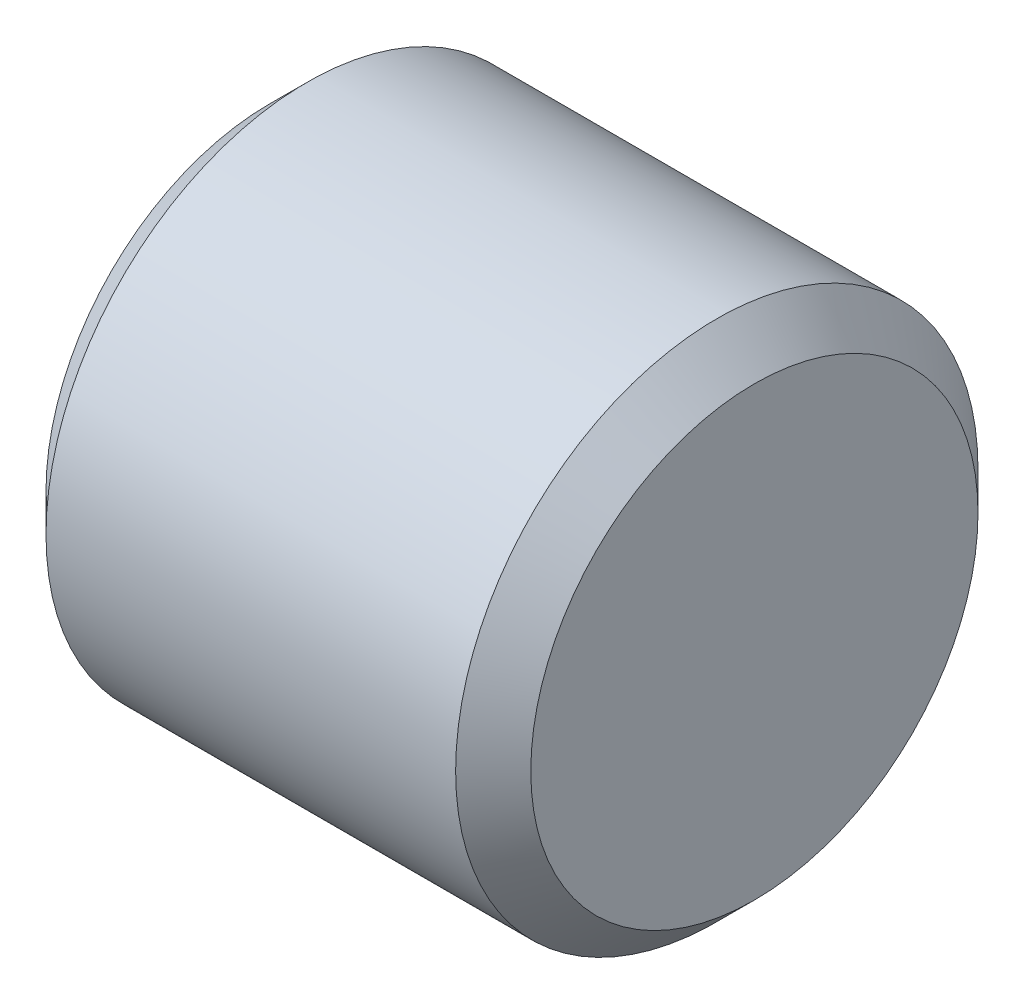
ISO-10303-21;
HEADER;
FILE_DESCRIPTION(('STEP AP214'),'2;1');
FILE_NAME('part.step','',(''),(''),'','','');
FILE_SCHEMA(('AUTOMOTIVE_DESIGN { 1 0 10303 214 1 1 1 1 }'));
ENDSEC;
DATA;
#1=APPLICATION_CONTEXT('core data for automotive mechanical design processes');
#2=APPLICATION_PROTOCOL_DEFINITION('international standard','automotive_design',2000,#1);
#3=PRODUCT_CONTEXT('',#1,'mechanical');
#4=PRODUCT('Part','Part','',(#3));
#5=PRODUCT_RELATED_PRODUCT_CATEGORY('part','',(#4));
#6=PRODUCT_DEFINITION_FORMATION('','',#4);
#7=PRODUCT_DEFINITION_CONTEXT('part definition',#1,'design');
#8=PRODUCT_DEFINITION('design','',#6,#7);
#9=PRODUCT_DEFINITION_SHAPE('','',#8);
#10=(LENGTH_UNIT() NAMED_UNIT(*) SI_UNIT(.MILLI.,.METRE.));
#11=(NAMED_UNIT(*) PLANE_ANGLE_UNIT() SI_UNIT($,.RADIAN.));
#12=(NAMED_UNIT(*) SI_UNIT($,.STERADIAN.) SOLID_ANGLE_UNIT());
#13=UNCERTAINTY_MEASURE_WITH_UNIT(LENGTH_MEASURE(1.E-05),#10,'distance_accuracy_value','');
#14=(GEOMETRIC_REPRESENTATION_CONTEXT(3) GLOBAL_UNCERTAINTY_ASSIGNED_CONTEXT((#13)) GLOBAL_UNIT_ASSIGNED_CONTEXT((#10,
#11,#12)) REPRESENTATION_CONTEXT('',''));
#15=CARTESIAN_POINT('',(0.,0.,0.));
#16=DIRECTION('',(0.,0.,1.));
#17=DIRECTION('',(1.,0.,0.));
#18=AXIS2_PLACEMENT_3D('',#15,#16,#17);
#19=CARTESIAN_POINT('',(111.633,-77.7875,241.3));
#20=DIRECTION('',(-1.,0.,0.));
#21=DIRECTION('',(0.,0.,1.));
#22=AXIS2_PLACEMENT_3D('',#19,#20,#21);
#23=CYLINDRICAL_SURFACE('',#22,17.653);
#24=CARTESIAN_POINT('',(81.407,-77.7875,241.3));
#25=DIRECTION('',(1.,0.,0.));
#26=DIRECTION('',(0.,0.,-1.));
#27=AXIS2_PLACEMENT_3D('',#24,#25,#26);
#28=CIRCLE('',#27,17.653);
#29=CARTESIAN_POINT('',(81.407,-77.7875,223.647));
#30=VERTEX_POINT('',#29);
#31=EDGE_CURVE('E27',#30,#30,#28,.T.);
#32=ORIENTED_EDGE('',*,*,#31,.T.);
#33=EDGE_LOOP('',(#32));
#34=FACE_BOUND('',#33,.T.);
#35=CARTESIAN_POINT('',(109.093,-77.7875,241.3));
#36=DIRECTION('',(1.,0.,0.));
#37=DIRECTION('',(0.,0.,-1.));
#38=AXIS2_PLACEMENT_3D('',#35,#36,#37);
#39=CIRCLE('',#38,17.653);
#40=CARTESIAN_POINT('',(109.093,-77.7875,223.647));
#41=VERTEX_POINT('',#40);
#42=EDGE_CURVE('E31',#41,#41,#39,.F.);
#43=ORIENTED_EDGE('',*,*,#42,.T.);
#44=EDGE_LOOP('',(#43));
#45=FACE_BOUND('',#44,.T.);
#46=ADVANCED_FACE('F15',(#34,#45),#23,.T.);
#47=CARTESIAN_POINT('',(111.633,-77.7875,241.3));
#48=DIRECTION('',(1.,0.,0.));
#49=DIRECTION('',(0.,1.,0.));
#50=AXIS2_PLACEMENT_3D('',#47,#48,#49);
#51=PLANE('',#50);
#52=CARTESIAN_POINT('',(111.633,-77.7875,241.3));
#53=DIRECTION('',(1.,0.,0.));
#54=DIRECTION('',(0.,0.,-1.));
#55=AXIS2_PLACEMENT_3D('',#52,#53,#54);
#56=CIRCLE('',#55,15.113);
#57=CARTESIAN_POINT('',(111.633,-77.7875,226.187));
#58=VERTEX_POINT('',#57);
#59=EDGE_CURVE('E10',#58,#58,#56,.T.);
#60=ORIENTED_EDGE('',*,*,#59,.T.);
#61=EDGE_LOOP('',(#60));
#62=FACE_BOUND('',#61,.T.);
#63=ADVANCED_FACE('F48',(#62),#51,.T.);
#64=CARTESIAN_POINT('',(78.867,-77.7875,241.3));
#65=DIRECTION('',(1.,0.,0.));
#66=DIRECTION('',(0.,1.,0.));
#67=AXIS2_PLACEMENT_3D('',#64,#65,#66);
#68=PLANE('',#67);
#69=CARTESIAN_POINT('',(78.867,-77.7875,241.3));
#70=DIRECTION('',(1.,0.,0.));
#71=DIRECTION('',(0.,0.,-1.));
#72=AXIS2_PLACEMENT_3D('',#69,#70,#71);
#73=CIRCLE('',#72,15.113);
#74=CARTESIAN_POINT('',(78.867,-77.7875,226.187));
#75=VERTEX_POINT('',#74);
#76=EDGE_CURVE('E23',#75,#75,#73,.F.);
#77=ORIENTED_EDGE('',*,*,#76,.T.);
#78=EDGE_LOOP('',(#77));
#79=FACE_BOUND('',#78,.T.);
#80=ADVANCED_FACE('F45',(#79),#68,.F.);
#81=CARTESIAN_POINT('',(81.407,-77.7875,241.3));
#82=DIRECTION('',(1.,0.,0.));
#83=DIRECTION('',(0.,0.,-1.));
#84=AXIS2_PLACEMENT_3D('',#81,#82,#83);
#85=CONICAL_SURFACE('',#84,17.653,0.785398163397451);
#86=ORIENTED_EDGE('',*,*,#76,.F.);
#87=EDGE_LOOP('',(#86));
#88=FACE_BOUND('',#87,.T.);
#89=ORIENTED_EDGE('',*,*,#31,.F.);
#90=EDGE_LOOP('',(#89));
#91=FACE_BOUND('',#90,.T.);
#92=ADVANCED_FACE('F40',(#88,#91),#85,.T.);
#93=CARTESIAN_POINT('',(111.633,-77.7875,241.3));
#94=DIRECTION('',(-1.,0.,0.));
#95=DIRECTION('',(0.,0.,1.));
#96=AXIS2_PLACEMENT_3D('',#93,#94,#95);
#97=CONICAL_SURFACE('',#96,15.113,0.785398163397451);
#98=ORIENTED_EDGE('',*,*,#42,.F.);
#99=EDGE_LOOP('',(#98));
#100=FACE_BOUND('',#99,.T.);
#101=ORIENTED_EDGE('',*,*,#59,.F.);
#102=EDGE_LOOP('',(#101));
#103=FACE_BOUND('',#102,.T.);
#104=ADVANCED_FACE('F18',(#100,#103),#97,.T.);
#105=CLOSED_SHELL('',(#46,#63,#80,#92,#104));
#106=MANIFOLD_SOLID_BREP('B1',#105);
#107=ADVANCED_BREP_SHAPE_REPRESENTATION('',(#18,#106),#14);
#108=SHAPE_DEFINITION_REPRESENTATION(#9,#107);
ENDSEC;
END-ISO-10303-21;
